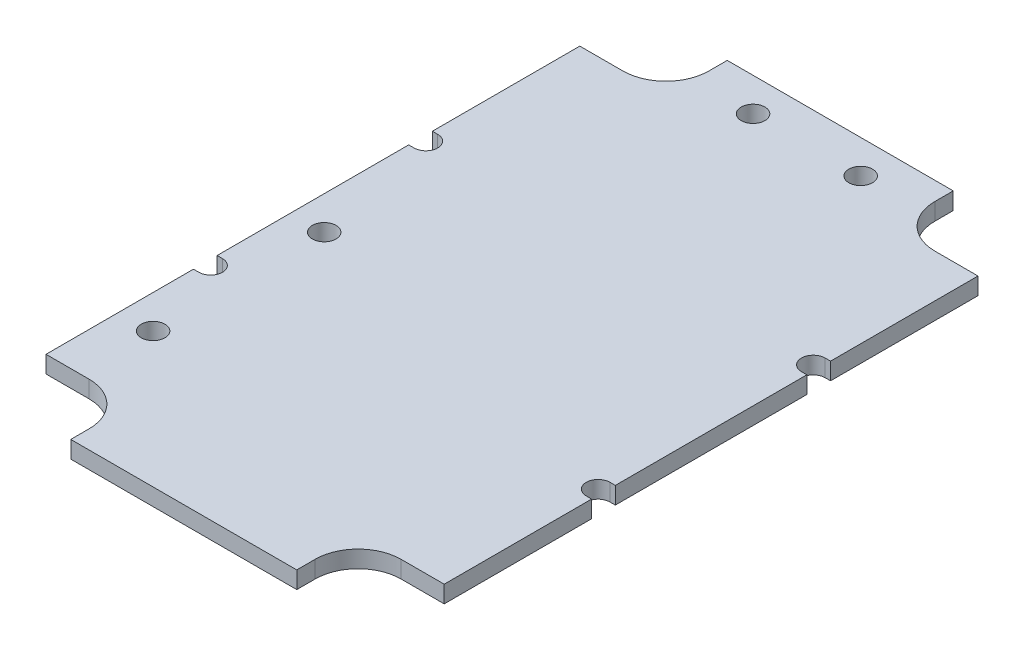
ISO-10303-21;
HEADER;
FILE_DESCRIPTION(('STEP AP214'),'2;1');
FILE_NAME('part.step','',(''),(''),'','','');
FILE_SCHEMA(('AUTOMOTIVE_DESIGN { 1 0 10303 214 1 1 1 1 }'));
ENDSEC;
DATA;
#1=APPLICATION_CONTEXT('core data for automotive mechanical design processes');
#2=APPLICATION_PROTOCOL_DEFINITION('international standard','automotive_design',2000,#1);
#3=PRODUCT_CONTEXT('',#1,'mechanical');
#4=PRODUCT('Part','Part','',(#3));
#5=PRODUCT_RELATED_PRODUCT_CATEGORY('part','',(#4));
#6=PRODUCT_DEFINITION_FORMATION('','',#4);
#7=PRODUCT_DEFINITION_CONTEXT('part definition',#1,'design');
#8=PRODUCT_DEFINITION('design','',#6,#7);
#9=PRODUCT_DEFINITION_SHAPE('','',#8);
#10=(LENGTH_UNIT() NAMED_UNIT(*) SI_UNIT(.MILLI.,.METRE.));
#11=(NAMED_UNIT(*) PLANE_ANGLE_UNIT() SI_UNIT($,.RADIAN.));
#12=(NAMED_UNIT(*) SI_UNIT($,.STERADIAN.) SOLID_ANGLE_UNIT());
#13=UNCERTAINTY_MEASURE_WITH_UNIT(LENGTH_MEASURE(1.E-05),#10,'distance_accuracy_value','');
#14=(GEOMETRIC_REPRESENTATION_CONTEXT(3) GLOBAL_UNCERTAINTY_ASSIGNED_CONTEXT((#13)) GLOBAL_UNIT_ASSIGNED_CONTEXT((#10,
#11,#12)) REPRESENTATION_CONTEXT('',''));
#15=CARTESIAN_POINT('',(0.,0.,0.));
#16=DIRECTION('',(0.,0.,1.));
#17=DIRECTION('',(1.,0.,0.));
#18=AXIS2_PLACEMENT_3D('',#15,#16,#17);
#19=CARTESIAN_POINT('',(0.,1.5875,0.));
#20=DIRECTION('',(0.,1.,0.));
#21=DIRECTION('',(0.,0.,1.));
#22=AXIS2_PLACEMENT_3D('',#19,#20,#21);
#23=PLANE('',#22);
#24=CARTESIAN_POINT('',(-15.4,1.5875,2.05));
#25=DIRECTION('',(0.,-1.,0.));
#26=DIRECTION('',(0.,0.,-1.));
#27=AXIS2_PLACEMENT_3D('',#24,#25,#26);
#28=CIRCLE('',#27,1.1);
#29=CARTESIAN_POINT('',(-15.4,1.5875,0.949999999999999));
#30=VERTEX_POINT('',#29);
#31=EDGE_CURVE('E802',#30,#30,#28,.T.);
#32=ORIENTED_EDGE('',*,*,#31,.T.);
#33=EDGE_LOOP('',(#32));
#34=FACE_BOUND('',#33,.T.);
#35=CARTESIAN_POINT('',(-15.4,1.5875,17.95));
#36=DIRECTION('',(0.,-1.,0.));
#37=DIRECTION('',(0.,0.,-1.));
#38=AXIS2_PLACEMENT_3D('',#35,#36,#37);
#39=CIRCLE('',#38,1.1);
#40=CARTESIAN_POINT('',(-15.4,1.5875,16.85));
#41=VERTEX_POINT('',#40);
#42=EDGE_CURVE('E810',#41,#41,#39,.T.);
#43=ORIENTED_EDGE('',*,*,#42,.T.);
#44=EDGE_LOOP('',(#43));
#45=FACE_BOUND('',#44,.T.);
#46=CARTESIAN_POINT('',(5.,1.5875,-27.4));
#47=DIRECTION('',(0.,-1.,0.));
#48=DIRECTION('',(0.,0.,-1.));
#49=AXIS2_PLACEMENT_3D('',#46,#47,#48);
#50=CIRCLE('',#49,1.1);
#51=CARTESIAN_POINT('',(5.,1.5875,-28.5));
#52=VERTEX_POINT('',#51);
#53=EDGE_CURVE('E816',#52,#52,#50,.T.);
#54=ORIENTED_EDGE('',*,*,#53,.T.);
#55=EDGE_LOOP('',(#54));
#56=FACE_BOUND('',#55,.T.);
#57=CARTESIAN_POINT('',(-5.,1.5875,-27.4));
#58=DIRECTION('',(0.,-1.,0.));
#59=DIRECTION('',(0.,0.,-1.));
#60=AXIS2_PLACEMENT_3D('',#57,#58,#59);
#61=CIRCLE('',#60,1.1);
#62=CARTESIAN_POINT('',(-5.,1.5875,-28.5));
#63=VERTEX_POINT('',#62);
#64=EDGE_CURVE('E329',#63,#63,#61,.T.);
#65=ORIENTED_EDGE('',*,*,#64,.T.);
#66=EDGE_LOOP('',(#65));
#67=FACE_BOUND('',#66,.T.);
#68=DIRECTION('',(-1.,0.,0.));
#69=VECTOR('',#68,1.);
#70=CARTESIAN_POINT('',(18.5,1.5875,-30.5));
#71=LINE('',#70,#69);
#72=CARTESIAN_POINT('',(10.5,1.5875,-30.5));
#73=VERTEX_POINT('',#72);
#74=CARTESIAN_POINT('',(-10.5,1.5875,-30.5));
#75=VERTEX_POINT('',#74);
#76=EDGE_CURVE('E299',#73,#75,#71,.T.);
#77=ORIENTED_EDGE('',*,*,#76,.T.);
#78=DIRECTION('',(0.,0.,1.));
#79=VECTOR('',#78,1.);
#80=CARTESIAN_POINT('',(-10.5,1.5875,-32.8));
#81=LINE('',#80,#79);
#82=CARTESIAN_POINT('',(-10.5,1.5875,-28.8));
#83=VERTEX_POINT('',#82);
#84=EDGE_CURVE('E48',#75,#83,#81,.T.);
#85=ORIENTED_EDGE('',*,*,#84,.T.);
#86=CARTESIAN_POINT('',(-14.5,1.5875,-28.8));
#87=DIRECTION('',(0.,-1.,0.));
#88=DIRECTION('',(0.,0.,-1.));
#89=AXIS2_PLACEMENT_3D('',#86,#87,#88);
#90=CIRCLE('',#89,4.);
#91=CARTESIAN_POINT('',(-14.5,1.5875,-24.8));
#92=VERTEX_POINT('',#91);
#93=EDGE_CURVE('E328',#83,#92,#90,.T.);
#94=ORIENTED_EDGE('',*,*,#93,.T.);
#95=DIRECTION('',(-1.,0.,0.));
#96=VECTOR('',#95,1.);
#97=CARTESIAN_POINT('',(-14.5,1.5875,-24.8));
#98=LINE('',#97,#96);
#99=CARTESIAN_POINT('',(-18.5,1.5875,-24.8));
#100=VERTEX_POINT('',#99);
#101=EDGE_CURVE('E326',#92,#100,#98,.T.);
#102=ORIENTED_EDGE('',*,*,#101,.T.);
#103=DIRECTION('',(0.,0.,1.));
#104=VECTOR('',#103,1.);
#105=CARTESIAN_POINT('',(-18.5,1.5875,30.5));
#106=LINE('',#105,#104);
#107=CARTESIAN_POINT('',(-18.5,1.5875,-11.1));
#108=VERTEX_POINT('',#107);
#109=EDGE_CURVE('E260',#100,#108,#106,.T.);
#110=ORIENTED_EDGE('',*,*,#109,.T.);
#111=DIRECTION('',(-1.,0.,0.));
#112=VECTOR('',#111,1.);
#113=CARTESIAN_POINT('',(-18.,1.5875,-11.1));
#114=LINE('',#113,#112);
#115=CARTESIAN_POINT('',(-18.,1.5875,-11.1));
#116=VERTEX_POINT('',#115);
#117=EDGE_CURVE('E456',#116,#108,#114,.T.);
#118=ORIENTED_EDGE('',*,*,#117,.F.);
#119=CARTESIAN_POINT('',(-18.,1.5875,-10.));
#120=DIRECTION('',(0.,1.,0.));
#121=DIRECTION('',(0.,0.,1.));
#122=AXIS2_PLACEMENT_3D('',#119,#120,#121);
#123=CIRCLE('',#122,1.1);
#124=CARTESIAN_POINT('',(-18.,1.5875,-8.9));
#125=VERTEX_POINT('',#124);
#126=EDGE_CURVE('E475',#125,#116,#123,.T.);
#127=ORIENTED_EDGE('',*,*,#126,.F.);
#128=DIRECTION('',(1.,0.,0.));
#129=VECTOR('',#128,1.);
#130=CARTESIAN_POINT('',(-18.,1.5875,-8.9));
#131=LINE('',#130,#129);
#132=CARTESIAN_POINT('',(-18.5,1.5875,-8.9));
#133=VERTEX_POINT('',#132);
#134=EDGE_CURVE('E465',#133,#125,#131,.T.);
#135=ORIENTED_EDGE('',*,*,#134,.F.);
#136=CARTESIAN_POINT('',(-18.5,1.5875,8.9));
#137=VERTEX_POINT('',#136);
#138=EDGE_CURVE('E302',#133,#137,#106,.T.);
#139=ORIENTED_EDGE('',*,*,#138,.T.);
#140=DIRECTION('',(-1.,0.,0.));
#141=VECTOR('',#140,1.);
#142=CARTESIAN_POINT('',(-18.,1.5875,8.9));
#143=LINE('',#142,#141);
#144=CARTESIAN_POINT('',(-18.,1.5875,8.9));
#145=VERTEX_POINT('',#144);
#146=EDGE_CURVE('E436',#145,#137,#143,.T.);
#147=ORIENTED_EDGE('',*,*,#146,.F.);
#148=CARTESIAN_POINT('',(-18.,1.5875,10.));
#149=DIRECTION('',(0.,1.,0.));
#150=DIRECTION('',(0.,0.,1.));
#151=AXIS2_PLACEMENT_3D('',#148,#149,#150);
#152=CIRCLE('',#151,1.1);
#153=CARTESIAN_POINT('',(-18.,1.5875,11.1));
#154=VERTEX_POINT('',#153);
#155=EDGE_CURVE('E291',#154,#145,#152,.T.);
#156=ORIENTED_EDGE('',*,*,#155,.F.);
#157=DIRECTION('',(1.,0.,0.));
#158=VECTOR('',#157,1.);
#159=CARTESIAN_POINT('',(-18.,1.5875,11.1));
#160=LINE('',#159,#158);
#161=CARTESIAN_POINT('',(-18.5,1.5875,11.1));
#162=VERTEX_POINT('',#161);
#163=EDGE_CURVE('E447',#162,#154,#160,.T.);
#164=ORIENTED_EDGE('',*,*,#163,.F.);
#165=CARTESIAN_POINT('',(-18.5,1.5875,24.8));
#166=VERTEX_POINT('',#165);
#167=EDGE_CURVE('E303',#162,#166,#106,.T.);
#168=ORIENTED_EDGE('',*,*,#167,.T.);
#169=DIRECTION('',(-1.,0.,0.));
#170=VECTOR('',#169,1.);
#171=CARTESIAN_POINT('',(-14.5,1.5875,24.8));
#172=LINE('',#171,#170);
#173=CARTESIAN_POINT('',(-14.5,1.5875,24.8));
#174=VERTEX_POINT('',#173);
#175=EDGE_CURVE('E383',#174,#166,#172,.T.);
#176=ORIENTED_EDGE('',*,*,#175,.F.);
#177=CARTESIAN_POINT('',(-14.5,1.5875,28.8));
#178=DIRECTION('',(0.,1.,0.));
#179=DIRECTION('',(0.,0.,1.));
#180=AXIS2_PLACEMENT_3D('',#177,#178,#179);
#181=CIRCLE('',#180,4.);
#182=CARTESIAN_POINT('',(-10.5,1.5875,28.8));
#183=VERTEX_POINT('',#182);
#184=EDGE_CURVE('E388',#183,#174,#181,.T.);
#185=ORIENTED_EDGE('',*,*,#184,.F.);
#186=DIRECTION('',(0.,0.,-1.));
#187=VECTOR('',#186,1.);
#188=CARTESIAN_POINT('',(-10.5,1.5875,32.8));
#189=LINE('',#188,#187);
#190=CARTESIAN_POINT('',(-10.5,1.5875,30.5));
#191=VERTEX_POINT('',#190);
#192=EDGE_CURVE('E378',#191,#183,#189,.T.);
#193=ORIENTED_EDGE('',*,*,#192,.F.);
#194=DIRECTION('',(1.,0.,0.));
#195=VECTOR('',#194,1.);
#196=CARTESIAN_POINT('',(18.5,1.5875,30.5));
#197=LINE('',#196,#195);
#198=CARTESIAN_POINT('',(10.5,1.5875,30.5));
#199=VERTEX_POINT('',#198);
#200=EDGE_CURVE('E301',#191,#199,#197,.T.);
#201=ORIENTED_EDGE('',*,*,#200,.T.);
#202=DIRECTION('',(0.,0.,-1.));
#203=VECTOR('',#202,1.);
#204=CARTESIAN_POINT('',(10.5,1.5875,32.8));
#205=LINE('',#204,#203);
#206=CARTESIAN_POINT('',(10.5,1.5875,28.8));
#207=VERTEX_POINT('',#206);
#208=EDGE_CURVE('E360',#199,#207,#205,.T.);
#209=ORIENTED_EDGE('',*,*,#208,.T.);
#210=CARTESIAN_POINT('',(14.5,1.5875,28.8));
#211=DIRECTION('',(0.,-1.,0.));
#212=DIRECTION('',(0.,0.,1.));
#213=AXIS2_PLACEMENT_3D('',#210,#211,#212);
#214=CIRCLE('',#213,4.);
#215=CARTESIAN_POINT('',(14.5,1.5875,24.8));
#216=VERTEX_POINT('',#215);
#217=EDGE_CURVE('E366',#207,#216,#214,.T.);
#218=ORIENTED_EDGE('',*,*,#217,.T.);
#219=DIRECTION('',(1.,0.,0.));
#220=VECTOR('',#219,1.);
#221=CARTESIAN_POINT('',(14.5,1.5875,24.8));
#222=LINE('',#221,#220);
#223=CARTESIAN_POINT('',(18.5,1.5875,24.8));
#224=VERTEX_POINT('',#223);
#225=EDGE_CURVE('E352',#216,#224,#222,.T.);
#226=ORIENTED_EDGE('',*,*,#225,.T.);
#227=DIRECTION('',(0.,0.,-1.));
#228=VECTOR('',#227,1.);
#229=CARTESIAN_POINT('',(18.5,1.5875,30.5));
#230=LINE('',#229,#228);
#231=CARTESIAN_POINT('',(18.5,1.5875,11.1));
#232=VERTEX_POINT('',#231);
#233=EDGE_CURVE('E307',#224,#232,#230,.T.);
#234=ORIENTED_EDGE('',*,*,#233,.T.);
#235=DIRECTION('',(1.,0.,0.));
#236=VECTOR('',#235,1.);
#237=CARTESIAN_POINT('',(18.,1.5875,11.1));
#238=LINE('',#237,#236);
#239=CARTESIAN_POINT('',(18.,1.5875,11.1));
#240=VERTEX_POINT('',#239);
#241=EDGE_CURVE('E401',#240,#232,#238,.T.);
#242=ORIENTED_EDGE('',*,*,#241,.F.);
#243=CARTESIAN_POINT('',(18.,1.5875,10.));
#244=DIRECTION('',(0.,1.,0.));
#245=DIRECTION('',(0.,0.,1.));
#246=AXIS2_PLACEMENT_3D('',#243,#244,#245);
#247=CIRCLE('',#246,1.1);
#248=CARTESIAN_POINT('',(18.,1.5875,8.9));
#249=VERTEX_POINT('',#248);
#250=EDGE_CURVE('E284',#249,#240,#247,.T.);
#251=ORIENTED_EDGE('',*,*,#250,.F.);
#252=DIRECTION('',(-1.,0.,0.));
#253=VECTOR('',#252,1.);
#254=CARTESIAN_POINT('',(18.,1.5875,8.9));
#255=LINE('',#254,#253);
#256=CARTESIAN_POINT('',(18.5,1.5875,8.9));
#257=VERTEX_POINT('',#256);
#258=EDGE_CURVE('E406',#257,#249,#255,.T.);
#259=ORIENTED_EDGE('',*,*,#258,.F.);
#260=CARTESIAN_POINT('',(18.5,1.5875,-8.9));
#261=VERTEX_POINT('',#260);
#262=EDGE_CURVE('E308',#257,#261,#230,.T.);
#263=ORIENTED_EDGE('',*,*,#262,.T.);
#264=DIRECTION('',(1.,0.,0.));
#265=VECTOR('',#264,1.);
#266=CARTESIAN_POINT('',(18.,1.5875,-8.9));
#267=LINE('',#266,#265);
#268=CARTESIAN_POINT('',(18.,1.5875,-8.9));
#269=VERTEX_POINT('',#268);
#270=EDGE_CURVE('E416',#269,#261,#267,.T.);
#271=ORIENTED_EDGE('',*,*,#270,.F.);
#272=CARTESIAN_POINT('',(18.,1.5875,-10.));
#273=DIRECTION('',(0.,1.,0.));
#274=DIRECTION('',(0.,0.,1.));
#275=AXIS2_PLACEMENT_3D('',#272,#273,#274);
#276=CIRCLE('',#275,1.1);
#277=CARTESIAN_POINT('',(18.,1.5875,-11.1));
#278=VERTEX_POINT('',#277);
#279=EDGE_CURVE('E278',#278,#269,#276,.T.);
#280=ORIENTED_EDGE('',*,*,#279,.F.);
#281=DIRECTION('',(-1.,0.,0.));
#282=VECTOR('',#281,1.);
#283=CARTESIAN_POINT('',(18.,1.5875,-11.1));
#284=LINE('',#283,#282);
#285=CARTESIAN_POINT('',(18.5,1.5875,-11.1));
#286=VERTEX_POINT('',#285);
#287=EDGE_CURVE('E427',#286,#278,#284,.T.);
#288=ORIENTED_EDGE('',*,*,#287,.F.);
#289=CARTESIAN_POINT('',(18.5,1.5875,-24.8));
#290=VERTEX_POINT('',#289);
#291=EDGE_CURVE('E306',#286,#290,#230,.T.);
#292=ORIENTED_EDGE('',*,*,#291,.T.);
#293=DIRECTION('',(1.,0.,0.));
#294=VECTOR('',#293,1.);
#295=CARTESIAN_POINT('',(14.5,1.5875,-24.8));
#296=LINE('',#295,#294);
#297=CARTESIAN_POINT('',(14.5,1.5875,-24.8));
#298=VERTEX_POINT('',#297);
#299=EDGE_CURVE('E337',#298,#290,#296,.T.);
#300=ORIENTED_EDGE('',*,*,#299,.F.);
#301=CARTESIAN_POINT('',(14.5,1.5875,-28.8));
#302=DIRECTION('',(0.,1.,0.));
#303=DIRECTION('',(0.,0.,-1.));
#304=AXIS2_PLACEMENT_3D('',#301,#302,#303);
#305=CIRCLE('',#304,4.);
#306=CARTESIAN_POINT('',(10.5,1.5875,-28.8));
#307=VERTEX_POINT('',#306);
#308=EDGE_CURVE('E345',#307,#298,#305,.T.);
#309=ORIENTED_EDGE('',*,*,#308,.F.);
#310=DIRECTION('',(0.,0.,1.));
#311=VECTOR('',#310,1.);
#312=CARTESIAN_POINT('',(10.5,1.5875,-32.8));
#313=LINE('',#312,#311);
#314=EDGE_CURVE('E315',#73,#307,#313,.T.);
#315=ORIENTED_EDGE('',*,*,#314,.F.);
#316=EDGE_LOOP('',(#77,#85,#94,#102,#110,#118,#127,#135,#139,#147,#156,#164,#168,#176,#185,#193,
#201,#209,#218,#226,#234,#242,#251,#259,#263,#271,#280,#288,#292,#300,#309,#315));
#317=FACE_BOUND('',#316,.T.);
#318=ADVANCED_FACE('F34',(#34,#45,#56,#67,#317),#23,.T.);
#319=CARTESIAN_POINT('',(0.,0.,0.));
#320=DIRECTION('',(0.,1.,0.));
#321=DIRECTION('',(0.,0.,1.));
#322=AXIS2_PLACEMENT_3D('',#319,#320,#321);
#323=PLANE('',#322);
#324=CARTESIAN_POINT('',(-15.4,0.,2.05));
#325=DIRECTION('',(0.,-1.,0.));
#326=DIRECTION('',(0.,0.,-1.));
#327=AXIS2_PLACEMENT_3D('',#324,#325,#326);
#328=CIRCLE('',#327,1.1);
#329=CARTESIAN_POINT('',(-15.4,0.,0.949999999999999));
#330=VERTEX_POINT('',#329);
#331=EDGE_CURVE('E805',#330,#330,#328,.T.);
#332=ORIENTED_EDGE('',*,*,#331,.F.);
#333=EDGE_LOOP('',(#332));
#334=FACE_BOUND('',#333,.T.);
#335=CARTESIAN_POINT('',(-15.4,0.,17.95));
#336=DIRECTION('',(0.,-1.,0.));
#337=DIRECTION('',(0.,0.,-1.));
#338=AXIS2_PLACEMENT_3D('',#335,#336,#337);
#339=CIRCLE('',#338,1.1);
#340=CARTESIAN_POINT('',(-15.4,0.,16.85));
#341=VERTEX_POINT('',#340);
#342=EDGE_CURVE('E807',#341,#341,#339,.T.);
#343=ORIENTED_EDGE('',*,*,#342,.F.);
#344=EDGE_LOOP('',(#343));
#345=FACE_BOUND('',#344,.T.);
#346=CARTESIAN_POINT('',(5.,0.,-27.4));
#347=DIRECTION('',(0.,-1.,0.));
#348=DIRECTION('',(0.,0.,-1.));
#349=AXIS2_PLACEMENT_3D('',#346,#347,#348);
#350=CIRCLE('',#349,1.1);
#351=CARTESIAN_POINT('',(5.,0.,-28.5));
#352=VERTEX_POINT('',#351);
#353=EDGE_CURVE('E813',#352,#352,#350,.T.);
#354=ORIENTED_EDGE('',*,*,#353,.F.);
#355=EDGE_LOOP('',(#354));
#356=FACE_BOUND('',#355,.T.);
#357=CARTESIAN_POINT('',(-5.,0.,-27.4));
#358=DIRECTION('',(0.,-1.,0.));
#359=DIRECTION('',(0.,0.,-1.));
#360=AXIS2_PLACEMENT_3D('',#357,#358,#359);
#361=CIRCLE('',#360,1.1);
#362=CARTESIAN_POINT('',(-5.,0.,-28.5));
#363=VERTEX_POINT('',#362);
#364=EDGE_CURVE('E819',#363,#363,#361,.T.);
#365=ORIENTED_EDGE('',*,*,#364,.F.);
#366=EDGE_LOOP('',(#365));
#367=FACE_BOUND('',#366,.T.);
#368=DIRECTION('',(0.,0.,1.));
#369=VECTOR('',#368,1.);
#370=CARTESIAN_POINT('',(-10.5,0.,-32.8));
#371=LINE('',#370,#369);
#372=CARTESIAN_POINT('',(-10.5,0.,-30.5));
#373=VERTEX_POINT('',#372);
#374=CARTESIAN_POINT('',(-10.5,0.,-28.8));
#375=VERTEX_POINT('',#374);
#376=EDGE_CURVE('E261',#373,#375,#371,.T.);
#377=ORIENTED_EDGE('',*,*,#376,.F.);
#378=DIRECTION('',(-1.,0.,0.));
#379=VECTOR('',#378,1.);
#380=CARTESIAN_POINT('',(18.5,0.,-30.5));
#381=LINE('',#380,#379);
#382=CARTESIAN_POINT('',(10.5,0.,-30.5));
#383=VERTEX_POINT('',#382);
#384=EDGE_CURVE('E320',#383,#373,#381,.T.);
#385=ORIENTED_EDGE('',*,*,#384,.F.);
#386=DIRECTION('',(0.,0.,1.));
#387=VECTOR('',#386,1.);
#388=CARTESIAN_POINT('',(10.5,0.,-32.8));
#389=LINE('',#388,#387);
#390=CARTESIAN_POINT('',(10.5,0.,-28.8));
#391=VERTEX_POINT('',#390);
#392=EDGE_CURVE('E56',#383,#391,#389,.T.);
#393=ORIENTED_EDGE('',*,*,#392,.T.);
#394=CARTESIAN_POINT('',(14.5,0.,-28.8));
#395=DIRECTION('',(0.,1.,0.));
#396=DIRECTION('',(0.,0.,-1.));
#397=AXIS2_PLACEMENT_3D('',#394,#395,#396);
#398=CIRCLE('',#397,4.);
#399=CARTESIAN_POINT('',(14.5,0.,-24.8));
#400=VERTEX_POINT('',#399);
#401=EDGE_CURVE('E336',#391,#400,#398,.T.);
#402=ORIENTED_EDGE('',*,*,#401,.T.);
#403=DIRECTION('',(1.,0.,0.));
#404=VECTOR('',#403,1.);
#405=CARTESIAN_POINT('',(14.5,0.,-24.8));
#406=LINE('',#405,#404);
#407=CARTESIAN_POINT('',(18.5,0.,-24.8));
#408=VERTEX_POINT('',#407);
#409=EDGE_CURVE('E340',#400,#408,#406,.T.);
#410=ORIENTED_EDGE('',*,*,#409,.T.);
#411=DIRECTION('',(0.,0.,-1.));
#412=VECTOR('',#411,1.);
#413=CARTESIAN_POINT('',(18.5,0.,30.5));
#414=LINE('',#413,#412);
#415=CARTESIAN_POINT('',(18.5,0.,-11.1));
#416=VERTEX_POINT('',#415);
#417=EDGE_CURVE('E273',#416,#408,#414,.T.);
#418=ORIENTED_EDGE('',*,*,#417,.F.);
#419=DIRECTION('',(-1.,0.,0.));
#420=VECTOR('',#419,1.);
#421=CARTESIAN_POINT('',(18.,0.,-11.1));
#422=LINE('',#421,#420);
#423=CARTESIAN_POINT('',(18.,0.,-11.1));
#424=VERTEX_POINT('',#423);
#425=EDGE_CURVE('E426',#416,#424,#422,.T.);
#426=ORIENTED_EDGE('',*,*,#425,.T.);
#427=CARTESIAN_POINT('',(18.,0.,-10.));
#428=DIRECTION('',(0.,1.,0.));
#429=DIRECTION('',(0.,0.,1.));
#430=AXIS2_PLACEMENT_3D('',#427,#428,#429);
#431=CIRCLE('',#430,1.1);
#432=CARTESIAN_POINT('',(18.,0.,-8.9));
#433=VERTEX_POINT('',#432);
#434=EDGE_CURVE('E295',#424,#433,#431,.T.);
#435=ORIENTED_EDGE('',*,*,#434,.T.);
#436=DIRECTION('',(1.,0.,0.));
#437=VECTOR('',#436,1.);
#438=CARTESIAN_POINT('',(18.,0.,-8.9));
#439=LINE('',#438,#437);
#440=CARTESIAN_POINT('',(18.5,0.,-8.9));
#441=VERTEX_POINT('',#440);
#442=EDGE_CURVE('E423',#433,#441,#439,.T.);
#443=ORIENTED_EDGE('',*,*,#442,.T.);
#444=CARTESIAN_POINT('',(18.5,0.,8.9));
#445=VERTEX_POINT('',#444);
#446=EDGE_CURVE('E545',#445,#441,#414,.T.);
#447=ORIENTED_EDGE('',*,*,#446,.F.);
#448=DIRECTION('',(-1.,0.,0.));
#449=VECTOR('',#448,1.);
#450=CARTESIAN_POINT('',(18.,0.,8.9));
#451=LINE('',#450,#449);
#452=CARTESIAN_POINT('',(18.,0.,8.9));
#453=VERTEX_POINT('',#452);
#454=EDGE_CURVE('E405',#445,#453,#451,.T.);
#455=ORIENTED_EDGE('',*,*,#454,.T.);
#456=CARTESIAN_POINT('',(18.,0.,10.));
#457=DIRECTION('',(0.,1.,0.));
#458=DIRECTION('',(0.,0.,1.));
#459=AXIS2_PLACEMENT_3D('',#456,#457,#458);
#460=CIRCLE('',#459,1.1);
#461=CARTESIAN_POINT('',(18.,0.,11.1));
#462=VERTEX_POINT('',#461);
#463=EDGE_CURVE('E298',#453,#462,#460,.T.);
#464=ORIENTED_EDGE('',*,*,#463,.T.);
#465=DIRECTION('',(1.,0.,0.));
#466=VECTOR('',#465,1.);
#467=CARTESIAN_POINT('',(18.,0.,11.1));
#468=LINE('',#467,#466);
#469=CARTESIAN_POINT('',(18.5,0.,11.1));
#470=VERTEX_POINT('',#469);
#471=EDGE_CURVE('E402',#462,#470,#468,.T.);
#472=ORIENTED_EDGE('',*,*,#471,.T.);
#473=CARTESIAN_POINT('',(18.5,0.,24.8));
#474=VERTEX_POINT('',#473);
#475=EDGE_CURVE('E527',#474,#470,#414,.T.);
#476=ORIENTED_EDGE('',*,*,#475,.F.);
#477=DIRECTION('',(1.,0.,0.));
#478=VECTOR('',#477,1.);
#479=CARTESIAN_POINT('',(14.5,0.,24.8));
#480=LINE('',#479,#478);
#481=CARTESIAN_POINT('',(14.5,0.,24.8));
#482=VERTEX_POINT('',#481);
#483=EDGE_CURVE('E357',#482,#474,#480,.T.);
#484=ORIENTED_EDGE('',*,*,#483,.F.);
#485=CARTESIAN_POINT('',(14.5,0.,28.8));
#486=DIRECTION('',(0.,-1.,0.));
#487=DIRECTION('',(0.,0.,1.));
#488=AXIS2_PLACEMENT_3D('',#485,#486,#487);
#489=CIRCLE('',#488,4.);
#490=CARTESIAN_POINT('',(10.5,0.,28.8));
#491=VERTEX_POINT('',#490);
#492=EDGE_CURVE('E359',#491,#482,#489,.T.);
#493=ORIENTED_EDGE('',*,*,#492,.F.);
#494=DIRECTION('',(0.,0.,-1.));
#495=VECTOR('',#494,1.);
#496=CARTESIAN_POINT('',(10.5,0.,0.));
#497=LINE('',#496,#495);
#498=CARTESIAN_POINT('',(10.5,0.,30.5));
#499=VERTEX_POINT('',#498);
#500=EDGE_CURVE('E514',#499,#491,#497,.T.);
#501=ORIENTED_EDGE('',*,*,#500,.F.);
#502=DIRECTION('',(1.,0.,0.));
#503=VECTOR('',#502,1.);
#504=CARTESIAN_POINT('',(18.5,0.,30.5));
#505=LINE('',#504,#503);
#506=CARTESIAN_POINT('',(-10.5,0.,30.5));
#507=VERTEX_POINT('',#506);
#508=EDGE_CURVE('E268',#507,#499,#505,.T.);
#509=ORIENTED_EDGE('',*,*,#508,.F.);
#510=DIRECTION('',(0.,0.,-1.));
#511=VECTOR('',#510,1.);
#512=CARTESIAN_POINT('',(-10.5,0.,0.));
#513=LINE('',#512,#511);
#514=CARTESIAN_POINT('',(-10.5,0.,28.8));
#515=VERTEX_POINT('',#514);
#516=EDGE_CURVE('E506',#507,#515,#513,.T.);
#517=ORIENTED_EDGE('',*,*,#516,.T.);
#518=CARTESIAN_POINT('',(-14.5,0.,28.8));
#519=DIRECTION('',(0.,1.,0.));
#520=DIRECTION('',(0.,0.,1.));
#521=AXIS2_PLACEMENT_3D('',#518,#519,#520);
#522=CIRCLE('',#521,4.);
#523=CARTESIAN_POINT('',(-14.5,0.,24.8));
#524=VERTEX_POINT('',#523);
#525=EDGE_CURVE('E379',#515,#524,#522,.T.);
#526=ORIENTED_EDGE('',*,*,#525,.T.);
#527=DIRECTION('',(-1.,0.,0.));
#528=VECTOR('',#527,1.);
#529=CARTESIAN_POINT('',(-14.5,0.,24.8));
#530=LINE('',#529,#528);
#531=CARTESIAN_POINT('',(-18.5,0.,24.8));
#532=VERTEX_POINT('',#531);
#533=EDGE_CURVE('E382',#524,#532,#530,.T.);
#534=ORIENTED_EDGE('',*,*,#533,.T.);
#535=DIRECTION('',(0.,0.,1.));
#536=VECTOR('',#535,1.);
#537=CARTESIAN_POINT('',(-18.5,0.,30.5));
#538=LINE('',#537,#536);
#539=CARTESIAN_POINT('',(-18.5,0.,11.1));
#540=VERTEX_POINT('',#539);
#541=EDGE_CURVE('E271',#540,#532,#538,.T.);
#542=ORIENTED_EDGE('',*,*,#541,.F.);
#543=DIRECTION('',(1.,0.,0.));
#544=VECTOR('',#543,1.);
#545=CARTESIAN_POINT('',(-18.,0.,11.1));
#546=LINE('',#545,#544);
#547=CARTESIAN_POINT('',(-18.,0.,11.1));
#548=VERTEX_POINT('',#547);
#549=EDGE_CURVE('E446',#540,#548,#546,.T.);
#550=ORIENTED_EDGE('',*,*,#549,.T.);
#551=CARTESIAN_POINT('',(-18.,0.,10.));
#552=DIRECTION('',(0.,1.,0.));
#553=DIRECTION('',(0.,0.,1.));
#554=AXIS2_PLACEMENT_3D('',#551,#552,#553);
#555=CIRCLE('',#554,1.1);
#556=CARTESIAN_POINT('',(-18.,0.,8.9));
#557=VERTEX_POINT('',#556);
#558=EDGE_CURVE('E503',#548,#557,#555,.T.);
#559=ORIENTED_EDGE('',*,*,#558,.T.);
#560=DIRECTION('',(-1.,0.,0.));
#561=VECTOR('',#560,1.);
#562=CARTESIAN_POINT('',(-18.,0.,8.9));
#563=LINE('',#562,#561);
#564=CARTESIAN_POINT('',(-18.5,0.,8.9));
#565=VERTEX_POINT('',#564);
#566=EDGE_CURVE('E443',#557,#565,#563,.T.);
#567=ORIENTED_EDGE('',*,*,#566,.T.);
#568=CARTESIAN_POINT('',(-18.5,0.,-8.9));
#569=VERTEX_POINT('',#568);
#570=EDGE_CURVE('E269',#569,#565,#538,.T.);
#571=ORIENTED_EDGE('',*,*,#570,.F.);
#572=DIRECTION('',(1.,0.,0.));
#573=VECTOR('',#572,1.);
#574=CARTESIAN_POINT('',(-18.,0.,-8.9));
#575=LINE('',#574,#573);
#576=CARTESIAN_POINT('',(-18.,0.,-8.9));
#577=VERTEX_POINT('',#576);
#578=EDGE_CURVE('E464',#569,#577,#575,.T.);
#579=ORIENTED_EDGE('',*,*,#578,.T.);
#580=CARTESIAN_POINT('',(-18.,0.,-10.));
#581=DIRECTION('',(0.,1.,0.));
#582=DIRECTION('',(0.,0.,1.));
#583=AXIS2_PLACEMENT_3D('',#580,#581,#582);
#584=CIRCLE('',#583,1.1);
#585=CARTESIAN_POINT('',(-18.,0.,-11.1));
#586=VERTEX_POINT('',#585);
#587=EDGE_CURVE('E504',#577,#586,#584,.T.);
#588=ORIENTED_EDGE('',*,*,#587,.T.);
#589=DIRECTION('',(-1.,0.,0.));
#590=VECTOR('',#589,1.);
#591=CARTESIAN_POINT('',(-18.,0.,-11.1));
#592=LINE('',#591,#590);
#593=CARTESIAN_POINT('',(-18.5,0.,-11.1));
#594=VERTEX_POINT('',#593);
#595=EDGE_CURVE('E267',#586,#594,#592,.T.);
#596=ORIENTED_EDGE('',*,*,#595,.T.);
#597=CARTESIAN_POINT('',(-18.5,0.,-24.8));
#598=VERTEX_POINT('',#597);
#599=EDGE_CURVE('E258',#598,#594,#538,.T.);
#600=ORIENTED_EDGE('',*,*,#599,.F.);
#601=DIRECTION('',(-1.,0.,0.));
#602=VECTOR('',#601,1.);
#603=CARTESIAN_POINT('',(-14.5,0.,-24.8));
#604=LINE('',#603,#602);
#605=CARTESIAN_POINT('',(-14.5,0.,-24.8));
#606=VERTEX_POINT('',#605);
#607=EDGE_CURVE('E242',#606,#598,#604,.T.);
#608=ORIENTED_EDGE('',*,*,#607,.F.);
#609=CARTESIAN_POINT('',(-14.5,0.,-28.8));
#610=DIRECTION('',(0.,-1.,0.));
#611=DIRECTION('',(0.,0.,-1.));
#612=AXIS2_PLACEMENT_3D('',#609,#610,#611);
#613=CIRCLE('',#612,4.);
#614=EDGE_CURVE('E252',#375,#606,#613,.T.);
#615=ORIENTED_EDGE('',*,*,#614,.F.);
#616=EDGE_LOOP('',(#377,#385,#393,#402,#410,#418,#426,#435,#443,#447,#455,#464,#472,#476,#484,
#493,#501,#509,#517,#526,#534,#542,#550,#559,#567,#571,#579,#588,#596,#600,#608,#615));
#617=FACE_BOUND('',#616,.T.);
#618=ADVANCED_FACE('F265',(#334,#345,#356,#367,#617),#323,.F.);
#619=CARTESIAN_POINT('',(-18.5,1.5875,30.5));
#620=DIRECTION('',(1.,0.,0.));
#621=DIRECTION('',(0.,0.,-1.));
#622=AXIS2_PLACEMENT_3D('',#619,#620,#621);
#623=PLANE('',#622);
#624=DIRECTION('',(0.,1.,0.));
#625=VECTOR('',#624,1.);
#626=CARTESIAN_POINT('',(-18.5,0.,-24.8));
#627=LINE('',#626,#625);
#628=EDGE_CURVE('E246',#598,#100,#627,.T.);
#629=ORIENTED_EDGE('',*,*,#628,.F.);
#630=ORIENTED_EDGE('',*,*,#599,.T.);
#631=DIRECTION('',(0.,1.,0.));
#632=VECTOR('',#631,1.);
#633=CARTESIAN_POINT('',(-18.5,0.,-11.1));
#634=LINE('',#633,#632);
#635=EDGE_CURVE('E478',#594,#108,#634,.T.);
#636=ORIENTED_EDGE('',*,*,#635,.T.);
#637=ORIENTED_EDGE('',*,*,#109,.F.);
#638=EDGE_LOOP('',(#629,#630,#636,#637));
#639=FACE_BOUND('',#638,.T.);
#640=ADVANCED_FACE('F256',(#639),#623,.F.);
#641=CARTESIAN_POINT('',(18.5,1.5875,-30.5));
#642=DIRECTION('',(0.,0.,1.));
#643=DIRECTION('',(1.,0.,0.));
#644=AXIS2_PLACEMENT_3D('',#641,#642,#643);
#645=PLANE('',#644);
#646=DIRECTION('',(0.,-1.,0.));
#647=VECTOR('',#646,1.);
#648=CARTESIAN_POINT('',(-10.5,1.5875,-30.5));
#649=LINE('',#648,#647);
#650=EDGE_CURVE('E11',#75,#373,#649,.T.);
#651=ORIENTED_EDGE('',*,*,#650,.F.);
#652=ORIENTED_EDGE('',*,*,#76,.F.);
#653=DIRECTION('',(0.,-1.,0.));
#654=VECTOR('',#653,1.);
#655=CARTESIAN_POINT('',(10.5,1.5875,-30.5));
#656=LINE('',#655,#654);
#657=EDGE_CURVE('E42',#73,#383,#656,.T.);
#658=ORIENTED_EDGE('',*,*,#657,.T.);
#659=ORIENTED_EDGE('',*,*,#384,.T.);
#660=EDGE_LOOP('',(#651,#652,#658,#659));
#661=FACE_BOUND('',#660,.T.);
#662=ADVANCED_FACE('F317',(#661),#645,.F.);
#663=CARTESIAN_POINT('',(18.5,1.5875,30.5));
#664=DIRECTION('',(-1.,0.,0.));
#665=DIRECTION('',(0.,0.,1.));
#666=AXIS2_PLACEMENT_3D('',#663,#664,#665);
#667=PLANE('',#666);
#668=DIRECTION('',(0.,1.,0.));
#669=VECTOR('',#668,1.);
#670=CARTESIAN_POINT('',(18.5,0.,24.8));
#671=LINE('',#670,#669);
#672=EDGE_CURVE('E363',#474,#224,#671,.T.);
#673=ORIENTED_EDGE('',*,*,#672,.F.);
#674=ORIENTED_EDGE('',*,*,#475,.T.);
#675=DIRECTION('',(0.,1.,0.));
#676=VECTOR('',#675,1.);
#677=CARTESIAN_POINT('',(18.5,0.,11.1));
#678=LINE('',#677,#676);
#679=EDGE_CURVE('E419',#470,#232,#678,.T.);
#680=ORIENTED_EDGE('',*,*,#679,.T.);
#681=ORIENTED_EDGE('',*,*,#233,.F.);
#682=EDGE_LOOP('',(#673,#674,#680,#681));
#683=FACE_BOUND('',#682,.T.);
#684=ADVANCED_FACE('F534',(#683),#667,.F.);
#685=CARTESIAN_POINT('',(18.5,1.5875,30.5));
#686=DIRECTION('',(0.,0.,-1.));
#687=DIRECTION('',(-1.,0.,0.));
#688=AXIS2_PLACEMENT_3D('',#685,#686,#687);
#689=PLANE('',#688);
#690=DIRECTION('',(0.,-1.,0.));
#691=VECTOR('',#690,1.);
#692=CARTESIAN_POINT('',(10.5,1.5875,30.5));
#693=LINE('',#692,#691);
#694=EDGE_CURVE('E373',#199,#499,#693,.T.);
#695=ORIENTED_EDGE('',*,*,#694,.F.);
#696=ORIENTED_EDGE('',*,*,#200,.F.);
#697=DIRECTION('',(0.,-1.,0.));
#698=VECTOR('',#697,1.);
#699=CARTESIAN_POINT('',(-10.5,1.5875,30.5));
#700=LINE('',#699,#698);
#701=EDGE_CURVE('E394',#191,#507,#700,.T.);
#702=ORIENTED_EDGE('',*,*,#701,.T.);
#703=ORIENTED_EDGE('',*,*,#508,.T.);
#704=EDGE_LOOP('',(#695,#696,#702,#703));
#705=FACE_BOUND('',#704,.T.);
#706=ADVANCED_FACE('F599',(#705),#689,.F.);
#707=CARTESIAN_POINT('',(18.,1.5875,10.));
#708=DIRECTION('',(0.,1.,0.));
#709=DIRECTION('',(0.,0.,1.));
#710=AXIS2_PLACEMENT_3D('',#707,#708,#709);
#711=CYLINDRICAL_SURFACE('',#710,1.1);
#712=DIRECTION('',(0.,1.,0.));
#713=VECTOR('',#712,1.);
#714=CARTESIAN_POINT('',(18.,0.,8.9));
#715=LINE('',#714,#713);
#716=EDGE_CURVE('E413',#453,#249,#715,.T.);
#717=ORIENTED_EDGE('',*,*,#716,.T.);
#718=ORIENTED_EDGE('',*,*,#250,.T.);
#719=DIRECTION('',(0.,1.,0.));
#720=VECTOR('',#719,1.);
#721=CARTESIAN_POINT('',(18.,0.,11.1));
#722=LINE('',#721,#720);
#723=EDGE_CURVE('E409',#462,#240,#722,.T.);
#724=ORIENTED_EDGE('',*,*,#723,.F.);
#725=ORIENTED_EDGE('',*,*,#463,.F.);
#726=EDGE_LOOP('',(#717,#718,#724,#725));
#727=FACE_BOUND('',#726,.T.);
#728=ADVANCED_FACE('F543',(#727),#711,.F.);
#729=CARTESIAN_POINT('',(18.,1.5875,-10.));
#730=DIRECTION('',(0.,1.,0.));
#731=DIRECTION('',(0.,0.,1.));
#732=AXIS2_PLACEMENT_3D('',#729,#730,#731);
#733=CYLINDRICAL_SURFACE('',#732,1.1);
#734=DIRECTION('',(0.,1.,0.));
#735=VECTOR('',#734,1.);
#736=CARTESIAN_POINT('',(18.,0.,-11.1));
#737=LINE('',#736,#735);
#738=EDGE_CURVE('E434',#424,#278,#737,.T.);
#739=ORIENTED_EDGE('',*,*,#738,.T.);
#740=ORIENTED_EDGE('',*,*,#279,.T.);
#741=DIRECTION('',(0.,1.,0.));
#742=VECTOR('',#741,1.);
#743=CARTESIAN_POINT('',(18.,0.,-8.9));
#744=LINE('',#743,#742);
#745=EDGE_CURVE('E430',#433,#269,#744,.T.);
#746=ORIENTED_EDGE('',*,*,#745,.F.);
#747=ORIENTED_EDGE('',*,*,#434,.F.);
#748=EDGE_LOOP('',(#739,#740,#746,#747));
#749=FACE_BOUND('',#748,.T.);
#750=ADVANCED_FACE('F592',(#749),#733,.F.);
#751=CARTESIAN_POINT('',(-18.,1.5875,10.));
#752=DIRECTION('',(0.,1.,0.));
#753=DIRECTION('',(0.,0.,1.));
#754=AXIS2_PLACEMENT_3D('',#751,#752,#753);
#755=CYLINDRICAL_SURFACE('',#754,1.1);
#756=DIRECTION('',(0.,1.,0.));
#757=VECTOR('',#756,1.);
#758=CARTESIAN_POINT('',(-18.,0.,11.1));
#759=LINE('',#758,#757);
#760=EDGE_CURVE('E453',#548,#154,#759,.T.);
#761=ORIENTED_EDGE('',*,*,#760,.T.);
#762=ORIENTED_EDGE('',*,*,#155,.T.);
#763=DIRECTION('',(0.,1.,0.));
#764=VECTOR('',#763,1.);
#765=CARTESIAN_POINT('',(-18.,0.,8.9));
#766=LINE('',#765,#764);
#767=EDGE_CURVE('E450',#557,#145,#766,.T.);
#768=ORIENTED_EDGE('',*,*,#767,.F.);
#769=ORIENTED_EDGE('',*,*,#558,.F.);
#770=EDGE_LOOP('',(#761,#762,#768,#769));
#771=FACE_BOUND('',#770,.T.);
#772=ADVANCED_FACE('F486',(#771),#755,.F.);
#773=CARTESIAN_POINT('',(-18.,1.5875,-10.));
#774=DIRECTION('',(0.,1.,0.));
#775=DIRECTION('',(0.,0.,1.));
#776=AXIS2_PLACEMENT_3D('',#773,#774,#775);
#777=CYLINDRICAL_SURFACE('',#776,1.1);
#778=DIRECTION('',(0.,1.,0.));
#779=VECTOR('',#778,1.);
#780=CARTESIAN_POINT('',(-18.,0.,-8.9));
#781=LINE('',#780,#779);
#782=EDGE_CURVE('E472',#577,#125,#781,.T.);
#783=ORIENTED_EDGE('',*,*,#782,.T.);
#784=ORIENTED_EDGE('',*,*,#126,.T.);
#785=DIRECTION('',(0.,1.,0.));
#786=VECTOR('',#785,1.);
#787=CARTESIAN_POINT('',(-18.,0.,-11.1));
#788=LINE('',#787,#786);
#789=EDGE_CURVE('E468',#586,#116,#788,.T.);
#790=ORIENTED_EDGE('',*,*,#789,.F.);
#791=ORIENTED_EDGE('',*,*,#587,.F.);
#792=EDGE_LOOP('',(#783,#784,#790,#791));
#793=FACE_BOUND('',#792,.T.);
#794=ADVANCED_FACE('F641',(#793),#777,.F.);
#795=ORIENTED_EDGE('',*,*,#570,.T.);
#796=DIRECTION('',(0.,1.,0.));
#797=VECTOR('',#796,1.);
#798=CARTESIAN_POINT('',(-18.5,0.,8.9));
#799=LINE('',#798,#797);
#800=EDGE_CURVE('E459',#565,#137,#799,.T.);
#801=ORIENTED_EDGE('',*,*,#800,.T.);
#802=ORIENTED_EDGE('',*,*,#138,.F.);
#803=DIRECTION('',(0.,1.,0.));
#804=VECTOR('',#803,1.);
#805=CARTESIAN_POINT('',(-18.5,0.,-8.9));
#806=LINE('',#805,#804);
#807=EDGE_CURVE('E476',#569,#133,#806,.T.);
#808=ORIENTED_EDGE('',*,*,#807,.F.);
#809=EDGE_LOOP('',(#795,#801,#802,#808));
#810=FACE_BOUND('',#809,.T.);
#811=ADVANCED_FACE('F499',(#810),#623,.F.);
#812=ORIENTED_EDGE('',*,*,#262,.F.);
#813=DIRECTION('',(0.,1.,0.));
#814=VECTOR('',#813,1.);
#815=CARTESIAN_POINT('',(18.5,0.,8.9));
#816=LINE('',#815,#814);
#817=EDGE_CURVE('E417',#445,#257,#816,.T.);
#818=ORIENTED_EDGE('',*,*,#817,.F.);
#819=ORIENTED_EDGE('',*,*,#446,.T.);
#820=DIRECTION('',(0.,1.,0.));
#821=VECTOR('',#820,1.);
#822=CARTESIAN_POINT('',(18.5,0.,-8.9));
#823=LINE('',#822,#821);
#824=EDGE_CURVE('E439',#441,#261,#823,.T.);
#825=ORIENTED_EDGE('',*,*,#824,.T.);
#826=EDGE_LOOP('',(#812,#818,#819,#825));
#827=FACE_BOUND('',#826,.T.);
#828=ADVANCED_FACE('F552',(#827),#667,.F.);
#829=ORIENTED_EDGE('',*,*,#541,.T.);
#830=DIRECTION('',(0.,1.,0.));
#831=VECTOR('',#830,1.);
#832=CARTESIAN_POINT('',(-18.5,0.,24.8));
#833=LINE('',#832,#831);
#834=EDGE_CURVE('E392',#532,#166,#833,.T.);
#835=ORIENTED_EDGE('',*,*,#834,.T.);
#836=ORIENTED_EDGE('',*,*,#167,.F.);
#837=DIRECTION('',(0.,1.,0.));
#838=VECTOR('',#837,1.);
#839=CARTESIAN_POINT('',(-18.5,0.,11.1));
#840=LINE('',#839,#838);
#841=EDGE_CURVE('E457',#540,#162,#840,.T.);
#842=ORIENTED_EDGE('',*,*,#841,.F.);
#843=EDGE_LOOP('',(#829,#835,#836,#842));
#844=FACE_BOUND('',#843,.T.);
#845=ADVANCED_FACE('F36',(#844),#623,.F.);
#846=ORIENTED_EDGE('',*,*,#417,.T.);
#847=DIRECTION('',(0.,1.,0.));
#848=VECTOR('',#847,1.);
#849=CARTESIAN_POINT('',(18.5,0.,-24.8));
#850=LINE('',#849,#848);
#851=EDGE_CURVE('E349',#408,#290,#850,.T.);
#852=ORIENTED_EDGE('',*,*,#851,.T.);
#853=ORIENTED_EDGE('',*,*,#291,.F.);
#854=DIRECTION('',(0.,1.,0.));
#855=VECTOR('',#854,1.);
#856=CARTESIAN_POINT('',(18.5,0.,-11.1));
#857=LINE('',#856,#855);
#858=EDGE_CURVE('E437',#416,#286,#857,.T.);
#859=ORIENTED_EDGE('',*,*,#858,.F.);
#860=EDGE_LOOP('',(#846,#852,#853,#859));
#861=FACE_BOUND('',#860,.T.);
#862=ADVANCED_FACE('F562',(#861),#667,.F.);
#863=CARTESIAN_POINT('',(-18.,0.,-11.1));
#864=DIRECTION('',(0.,0.,-1.));
#865=DIRECTION('',(-1.,0.,0.));
#866=AXIS2_PLACEMENT_3D('',#863,#864,#865);
#867=PLANE('',#866);
#868=ORIENTED_EDGE('',*,*,#117,.T.);
#869=ORIENTED_EDGE('',*,*,#635,.F.);
#870=ORIENTED_EDGE('',*,*,#595,.F.);
#871=ORIENTED_EDGE('',*,*,#789,.T.);
#872=EDGE_LOOP('',(#868,#869,#870,#871));
#873=FACE_BOUND('',#872,.T.);
#874=ADVANCED_FACE('F598',(#873),#867,.F.);
#875=CARTESIAN_POINT('',(-18.,0.,-8.9));
#876=DIRECTION('',(0.,0.,1.));
#877=DIRECTION('',(1.,0.,0.));
#878=AXIS2_PLACEMENT_3D('',#875,#876,#877);
#879=PLANE('',#878);
#880=ORIENTED_EDGE('',*,*,#134,.T.);
#881=ORIENTED_EDGE('',*,*,#782,.F.);
#882=ORIENTED_EDGE('',*,*,#578,.F.);
#883=ORIENTED_EDGE('',*,*,#807,.T.);
#884=EDGE_LOOP('',(#880,#881,#882,#883));
#885=FACE_BOUND('',#884,.T.);
#886=ADVANCED_FACE('F631',(#885),#879,.F.);
#887=CARTESIAN_POINT('',(-18.,0.,8.9));
#888=DIRECTION('',(0.,0.,-1.));
#889=DIRECTION('',(-1.,0.,0.));
#890=AXIS2_PLACEMENT_3D('',#887,#888,#889);
#891=PLANE('',#890);
#892=ORIENTED_EDGE('',*,*,#146,.T.);
#893=ORIENTED_EDGE('',*,*,#800,.F.);
#894=ORIENTED_EDGE('',*,*,#566,.F.);
#895=ORIENTED_EDGE('',*,*,#767,.T.);
#896=EDGE_LOOP('',(#892,#893,#894,#895));
#897=FACE_BOUND('',#896,.T.);
#898=ADVANCED_FACE('F497',(#897),#891,.F.);
#899=CARTESIAN_POINT('',(-18.,0.,11.1));
#900=DIRECTION('',(0.,0.,1.));
#901=DIRECTION('',(1.,0.,0.));
#902=AXIS2_PLACEMENT_3D('',#899,#900,#901);
#903=PLANE('',#902);
#904=ORIENTED_EDGE('',*,*,#163,.T.);
#905=ORIENTED_EDGE('',*,*,#760,.F.);
#906=ORIENTED_EDGE('',*,*,#549,.F.);
#907=ORIENTED_EDGE('',*,*,#841,.T.);
#908=EDGE_LOOP('',(#904,#905,#906,#907));
#909=FACE_BOUND('',#908,.T.);
#910=ADVANCED_FACE('F620',(#909),#903,.F.);
#911=CARTESIAN_POINT('',(18.,0.,-8.9));
#912=DIRECTION('',(0.,0.,1.));
#913=DIRECTION('',(1.,0.,0.));
#914=AXIS2_PLACEMENT_3D('',#911,#912,#913);
#915=PLANE('',#914);
#916=ORIENTED_EDGE('',*,*,#270,.T.);
#917=ORIENTED_EDGE('',*,*,#824,.F.);
#918=ORIENTED_EDGE('',*,*,#442,.F.);
#919=ORIENTED_EDGE('',*,*,#745,.T.);
#920=EDGE_LOOP('',(#916,#917,#918,#919));
#921=FACE_BOUND('',#920,.T.);
#922=ADVANCED_FACE('F622',(#921),#915,.F.);
#923=CARTESIAN_POINT('',(18.,0.,-11.1));
#924=DIRECTION('',(0.,0.,-1.));
#925=DIRECTION('',(-1.,0.,0.));
#926=AXIS2_PLACEMENT_3D('',#923,#924,#925);
#927=PLANE('',#926);
#928=ORIENTED_EDGE('',*,*,#287,.T.);
#929=ORIENTED_EDGE('',*,*,#738,.F.);
#930=ORIENTED_EDGE('',*,*,#425,.F.);
#931=ORIENTED_EDGE('',*,*,#858,.T.);
#932=EDGE_LOOP('',(#928,#929,#930,#931));
#933=FACE_BOUND('',#932,.T.);
#934=ADVANCED_FACE('F628',(#933),#927,.F.);
#935=CARTESIAN_POINT('',(18.,0.,11.1));
#936=DIRECTION('',(0.,0.,1.));
#937=DIRECTION('',(1.,0.,0.));
#938=AXIS2_PLACEMENT_3D('',#935,#936,#937);
#939=PLANE('',#938);
#940=ORIENTED_EDGE('',*,*,#241,.T.);
#941=ORIENTED_EDGE('',*,*,#679,.F.);
#942=ORIENTED_EDGE('',*,*,#471,.F.);
#943=ORIENTED_EDGE('',*,*,#723,.T.);
#944=EDGE_LOOP('',(#940,#941,#942,#943));
#945=FACE_BOUND('',#944,.T.);
#946=ADVANCED_FACE('F539',(#945),#939,.F.);
#947=CARTESIAN_POINT('',(18.,0.,8.9));
#948=DIRECTION('',(0.,0.,-1.));
#949=DIRECTION('',(-1.,0.,0.));
#950=AXIS2_PLACEMENT_3D('',#947,#948,#949);
#951=PLANE('',#950);
#952=ORIENTED_EDGE('',*,*,#258,.T.);
#953=ORIENTED_EDGE('',*,*,#716,.F.);
#954=ORIENTED_EDGE('',*,*,#454,.F.);
#955=ORIENTED_EDGE('',*,*,#817,.T.);
#956=EDGE_LOOP('',(#952,#953,#954,#955));
#957=FACE_BOUND('',#956,.T.);
#958=ADVANCED_FACE('F548',(#957),#951,.F.);
#959=CARTESIAN_POINT('',(-10.5,0.,32.8));
#960=DIRECTION('',(1.,0.,0.));
#961=DIRECTION('',(0.,0.,-1.));
#962=AXIS2_PLACEMENT_3D('',#959,#960,#961);
#963=PLANE('',#962);
#964=ORIENTED_EDGE('',*,*,#192,.T.);
#965=DIRECTION('',(0.,1.,0.));
#966=VECTOR('',#965,1.);
#967=CARTESIAN_POINT('',(-10.5,0.,28.8));
#968=LINE('',#967,#966);
#969=EDGE_CURVE('E386',#515,#183,#968,.T.);
#970=ORIENTED_EDGE('',*,*,#969,.F.);
#971=ORIENTED_EDGE('',*,*,#516,.F.);
#972=ORIENTED_EDGE('',*,*,#701,.F.);
#973=EDGE_LOOP('',(#964,#970,#971,#972));
#974=FACE_BOUND('',#973,.T.);
#975=ADVANCED_FACE('F612',(#974),#963,.F.);
#976=CARTESIAN_POINT('',(-14.5,0.,24.8));
#977=DIRECTION('',(0.,0.,-1.));
#978=DIRECTION('',(-1.,0.,0.));
#979=AXIS2_PLACEMENT_3D('',#976,#977,#978);
#980=PLANE('',#979);
#981=ORIENTED_EDGE('',*,*,#175,.T.);
#982=ORIENTED_EDGE('',*,*,#834,.F.);
#983=ORIENTED_EDGE('',*,*,#533,.F.);
#984=DIRECTION('',(0.,1.,0.));
#985=VECTOR('',#984,1.);
#986=CARTESIAN_POINT('',(-14.5,0.,24.8));
#987=LINE('',#986,#985);
#988=EDGE_CURVE('E395',#524,#174,#987,.T.);
#989=ORIENTED_EDGE('',*,*,#988,.T.);
#990=EDGE_LOOP('',(#981,#982,#983,#989));
#991=FACE_BOUND('',#990,.T.);
#992=ADVANCED_FACE('F617',(#991),#980,.F.);
#993=CARTESIAN_POINT('',(-14.5,0.,28.8));
#994=DIRECTION('',(0.,1.,0.));
#995=DIRECTION('',(0.,0.,1.));
#996=AXIS2_PLACEMENT_3D('',#993,#994,#995);
#997=CYLINDRICAL_SURFACE('',#996,4.);
#998=ORIENTED_EDGE('',*,*,#184,.T.);
#999=ORIENTED_EDGE('',*,*,#988,.F.);
#1000=ORIENTED_EDGE('',*,*,#525,.F.);
#1001=ORIENTED_EDGE('',*,*,#969,.T.);
#1002=EDGE_LOOP('',(#998,#999,#1000,#1001));
#1003=FACE_BOUND('',#1002,.T.);
#1004=ADVANCED_FACE('F614',(#1003),#997,.F.);
#1005=CARTESIAN_POINT('',(10.5,0.,32.8));
#1006=DIRECTION('',(1.,0.,0.));
#1007=DIRECTION('',(0.,0.,-1.));
#1008=AXIS2_PLACEMENT_3D('',#1005,#1006,#1007);
#1009=PLANE('',#1008);
#1010=ORIENTED_EDGE('',*,*,#694,.T.);
#1011=ORIENTED_EDGE('',*,*,#500,.T.);
#1012=DIRECTION('',(0.,1.,0.));
#1013=VECTOR('',#1012,1.);
#1014=CARTESIAN_POINT('',(10.5,0.,28.8));
#1015=LINE('',#1014,#1013);
#1016=EDGE_CURVE('E371',#491,#207,#1015,.T.);
#1017=ORIENTED_EDGE('',*,*,#1016,.T.);
#1018=ORIENTED_EDGE('',*,*,#208,.F.);
#1019=EDGE_LOOP('',(#1010,#1011,#1017,#1018));
#1020=FACE_BOUND('',#1019,.T.);
#1021=ADVANCED_FACE('F518',(#1020),#1009,.T.);
#1022=CARTESIAN_POINT('',(14.5,0.,28.8));
#1023=DIRECTION('',(0.,1.,0.));
#1024=DIRECTION('',(0.,0.,1.));
#1025=AXIS2_PLACEMENT_3D('',#1022,#1023,#1024);
#1026=CYLINDRICAL_SURFACE('',#1025,4.);
#1027=ORIENTED_EDGE('',*,*,#217,.F.);
#1028=ORIENTED_EDGE('',*,*,#1016,.F.);
#1029=ORIENTED_EDGE('',*,*,#492,.T.);
#1030=DIRECTION('',(0.,1.,0.));
#1031=VECTOR('',#1030,1.);
#1032=CARTESIAN_POINT('',(14.5,0.,24.8));
#1033=LINE('',#1032,#1031);
#1034=EDGE_CURVE('E374',#482,#216,#1033,.T.);
#1035=ORIENTED_EDGE('',*,*,#1034,.T.);
#1036=EDGE_LOOP('',(#1027,#1028,#1029,#1035));
#1037=FACE_BOUND('',#1036,.T.);
#1038=ADVANCED_FACE('F524',(#1037),#1026,.F.);
#1039=CARTESIAN_POINT('',(14.5,0.,24.8));
#1040=DIRECTION('',(0.,0.,1.));
#1041=DIRECTION('',(1.,0.,0.));
#1042=AXIS2_PLACEMENT_3D('',#1039,#1040,#1041);
#1043=PLANE('',#1042);
#1044=ORIENTED_EDGE('',*,*,#225,.F.);
#1045=ORIENTED_EDGE('',*,*,#1034,.F.);
#1046=ORIENTED_EDGE('',*,*,#483,.T.);
#1047=ORIENTED_EDGE('',*,*,#672,.T.);
#1048=EDGE_LOOP('',(#1044,#1045,#1046,#1047));
#1049=FACE_BOUND('',#1048,.T.);
#1050=ADVANCED_FACE('F531',(#1049),#1043,.T.);
#1051=CARTESIAN_POINT('',(10.5,0.,-32.8));
#1052=DIRECTION('',(-1.,0.,0.));
#1053=DIRECTION('',(0.,0.,1.));
#1054=AXIS2_PLACEMENT_3D('',#1051,#1052,#1053);
#1055=PLANE('',#1054);
#1056=ORIENTED_EDGE('',*,*,#314,.T.);
#1057=DIRECTION('',(0.,1.,0.));
#1058=VECTOR('',#1057,1.);
#1059=CARTESIAN_POINT('',(10.5,0.,-28.8));
#1060=LINE('',#1059,#1058);
#1061=EDGE_CURVE('E343',#391,#307,#1060,.T.);
#1062=ORIENTED_EDGE('',*,*,#1061,.F.);
#1063=ORIENTED_EDGE('',*,*,#392,.F.);
#1064=ORIENTED_EDGE('',*,*,#657,.F.);
#1065=EDGE_LOOP('',(#1056,#1062,#1063,#1064));
#1066=FACE_BOUND('',#1065,.T.);
#1067=ADVANCED_FACE('F570',(#1066),#1055,.F.);
#1068=CARTESIAN_POINT('',(14.5,0.,-24.8));
#1069=DIRECTION('',(0.,0.,1.));
#1070=DIRECTION('',(1.,0.,0.));
#1071=AXIS2_PLACEMENT_3D('',#1068,#1069,#1070);
#1072=PLANE('',#1071);
#1073=ORIENTED_EDGE('',*,*,#299,.T.);
#1074=ORIENTED_EDGE('',*,*,#851,.F.);
#1075=ORIENTED_EDGE('',*,*,#409,.F.);
#1076=DIRECTION('',(0.,1.,0.));
#1077=VECTOR('',#1076,1.);
#1078=CARTESIAN_POINT('',(14.5,0.,-24.8));
#1079=LINE('',#1078,#1077);
#1080=EDGE_CURVE('E353',#400,#298,#1079,.T.);
#1081=ORIENTED_EDGE('',*,*,#1080,.T.);
#1082=EDGE_LOOP('',(#1073,#1074,#1075,#1081));
#1083=FACE_BOUND('',#1082,.T.);
#1084=ADVANCED_FACE('F566',(#1083),#1072,.F.);
#1085=CARTESIAN_POINT('',(14.5,0.,-28.8));
#1086=DIRECTION('',(0.,1.,0.));
#1087=DIRECTION('',(0.,0.,1.));
#1088=AXIS2_PLACEMENT_3D('',#1085,#1086,#1087);
#1089=CYLINDRICAL_SURFACE('',#1088,4.);
#1090=ORIENTED_EDGE('',*,*,#308,.T.);
#1091=ORIENTED_EDGE('',*,*,#1080,.F.);
#1092=ORIENTED_EDGE('',*,*,#401,.F.);
#1093=ORIENTED_EDGE('',*,*,#1061,.T.);
#1094=EDGE_LOOP('',(#1090,#1091,#1092,#1093));
#1095=FACE_BOUND('',#1094,.T.);
#1096=ADVANCED_FACE('F569',(#1095),#1089,.F.);
#1097=CARTESIAN_POINT('',(-10.5,0.,-32.8));
#1098=DIRECTION('',(-1.,0.,0.));
#1099=DIRECTION('',(0.,0.,1.));
#1100=AXIS2_PLACEMENT_3D('',#1097,#1098,#1099);
#1101=PLANE('',#1100);
#1102=ORIENTED_EDGE('',*,*,#650,.T.);
#1103=ORIENTED_EDGE('',*,*,#376,.T.);
#1104=DIRECTION('',(0.,1.,0.));
#1105=VECTOR('',#1104,1.);
#1106=CARTESIAN_POINT('',(-10.5,0.,-28.8));
#1107=LINE('',#1106,#1105);
#1108=EDGE_CURVE('E332',#375,#83,#1107,.T.);
#1109=ORIENTED_EDGE('',*,*,#1108,.T.);
#1110=ORIENTED_EDGE('',*,*,#84,.F.);
#1111=EDGE_LOOP('',(#1102,#1103,#1109,#1110));
#1112=FACE_BOUND('',#1111,.T.);
#1113=ADVANCED_FACE('F321',(#1112),#1101,.T.);
#1114=CARTESIAN_POINT('',(-14.5,0.,-28.8));
#1115=DIRECTION('',(0.,1.,0.));
#1116=DIRECTION('',(0.,0.,1.));
#1117=AXIS2_PLACEMENT_3D('',#1114,#1115,#1116);
#1118=CYLINDRICAL_SURFACE('',#1117,4.);
#1119=ORIENTED_EDGE('',*,*,#93,.F.);
#1120=ORIENTED_EDGE('',*,*,#1108,.F.);
#1121=ORIENTED_EDGE('',*,*,#614,.T.);
#1122=DIRECTION('',(0.,1.,0.));
#1123=VECTOR('',#1122,1.);
#1124=CARTESIAN_POINT('',(-14.5,0.,-24.8));
#1125=LINE('',#1124,#1123);
#1126=EDGE_CURVE('E248',#606,#92,#1125,.T.);
#1127=ORIENTED_EDGE('',*,*,#1126,.T.);
#1128=EDGE_LOOP('',(#1119,#1120,#1121,#1127));
#1129=FACE_BOUND('',#1128,.T.);
#1130=ADVANCED_FACE('F731',(#1129),#1118,.F.);
#1131=CARTESIAN_POINT('',(-14.5,0.,-24.8));
#1132=DIRECTION('',(0.,0.,-1.));
#1133=DIRECTION('',(-1.,0.,0.));
#1134=AXIS2_PLACEMENT_3D('',#1131,#1132,#1133);
#1135=PLANE('',#1134);
#1136=ORIENTED_EDGE('',*,*,#101,.F.);
#1137=ORIENTED_EDGE('',*,*,#1126,.F.);
#1138=ORIENTED_EDGE('',*,*,#607,.T.);
#1139=ORIENTED_EDGE('',*,*,#628,.T.);
#1140=EDGE_LOOP('',(#1136,#1137,#1138,#1139));
#1141=FACE_BOUND('',#1140,.T.);
#1142=ADVANCED_FACE('F245',(#1141),#1135,.T.);
#1143=CARTESIAN_POINT('',(-5.,1.5875,-27.4));
#1144=DIRECTION('',(0.,-1.,0.));
#1145=DIRECTION('',(0.,0.,-1.));
#1146=AXIS2_PLACEMENT_3D('',#1143,#1144,#1145);
#1147=CYLINDRICAL_SURFACE('',#1146,1.1);
#1148=ORIENTED_EDGE('',*,*,#64,.F.);
#1149=EDGE_LOOP('',(#1148));
#1150=FACE_BOUND('',#1149,.T.);
#1151=ORIENTED_EDGE('',*,*,#364,.T.);
#1152=EDGE_LOOP('',(#1151));
#1153=FACE_BOUND('',#1152,.T.);
#1154=ADVANCED_FACE('F748',(#1150,#1153),#1147,.F.);
#1155=CARTESIAN_POINT('',(5.,1.5875,-27.4));
#1156=DIRECTION('',(0.,-1.,0.));
#1157=DIRECTION('',(0.,0.,-1.));
#1158=AXIS2_PLACEMENT_3D('',#1155,#1156,#1157);
#1159=CYLINDRICAL_SURFACE('',#1158,1.1);
#1160=ORIENTED_EDGE('',*,*,#53,.F.);
#1161=EDGE_LOOP('',(#1160));
#1162=FACE_BOUND('',#1161,.T.);
#1163=ORIENTED_EDGE('',*,*,#353,.T.);
#1164=EDGE_LOOP('',(#1163));
#1165=FACE_BOUND('',#1164,.T.);
#1166=ADVANCED_FACE('F766',(#1162,#1165),#1159,.F.);
#1167=CARTESIAN_POINT('',(-15.4,1.5875,17.95));
#1168=DIRECTION('',(0.,-1.,0.));
#1169=DIRECTION('',(0.,0.,-1.));
#1170=AXIS2_PLACEMENT_3D('',#1167,#1168,#1169);
#1171=CYLINDRICAL_SURFACE('',#1170,1.1);
#1172=ORIENTED_EDGE('',*,*,#42,.F.);
#1173=EDGE_LOOP('',(#1172));
#1174=FACE_BOUND('',#1173,.T.);
#1175=ORIENTED_EDGE('',*,*,#342,.T.);
#1176=EDGE_LOOP('',(#1175));
#1177=FACE_BOUND('',#1176,.T.);
#1178=ADVANCED_FACE('F776',(#1174,#1177),#1171,.F.);
#1179=CARTESIAN_POINT('',(-15.4,1.5875,2.05));
#1180=DIRECTION('',(0.,-1.,0.));
#1181=DIRECTION('',(0.,0.,-1.));
#1182=AXIS2_PLACEMENT_3D('',#1179,#1180,#1181);
#1183=CYLINDRICAL_SURFACE('',#1182,1.1);
#1184=ORIENTED_EDGE('',*,*,#31,.F.);
#1185=EDGE_LOOP('',(#1184));
#1186=FACE_BOUND('',#1185,.T.);
#1187=ORIENTED_EDGE('',*,*,#331,.T.);
#1188=EDGE_LOOP('',(#1187));
#1189=FACE_BOUND('',#1188,.T.);
#1190=ADVANCED_FACE('F786',(#1186,#1189),#1183,.F.);
#1191=CLOSED_SHELL('',(#318,#618,#640,#662,#684,#706,#728,#750,#772,#794,#811,#828,#845,#862,
#874,#886,#898,#910,#922,#934,#946,#958,#975,#992,#1004,#1021,#1038,#1050,#1067,#1084,#1096,
#1113,#1130,#1142,#1154,#1166,#1178,#1190));
#1192=MANIFOLD_SOLID_BREP('B2',#1191);
#1193=ADVANCED_BREP_SHAPE_REPRESENTATION('',(#18,#1192),#14);
#1194=SHAPE_DEFINITION_REPRESENTATION(#9,#1193);
ENDSEC;
END-ISO-10303-21;
